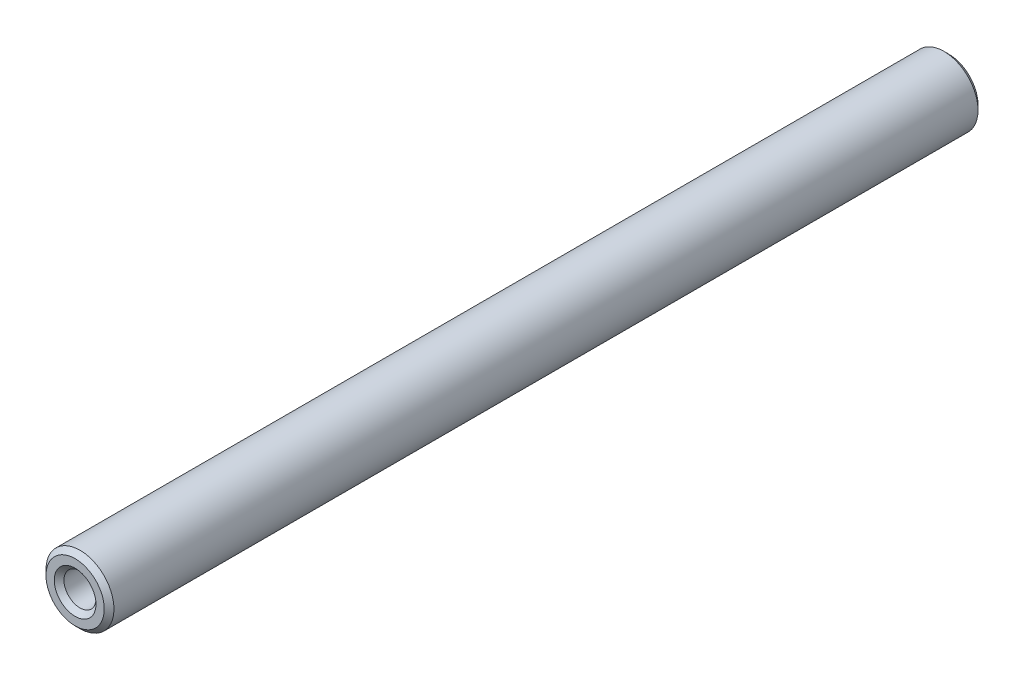
ISO-10303-21;
HEADER;
FILE_DESCRIPTION(('STEP AP214'),'2;1');
FILE_NAME('part.step','',(''),(''),'','','');
FILE_SCHEMA(('AUTOMOTIVE_DESIGN { 1 0 10303 214 1 1 1 1 }'));
ENDSEC;
DATA;
#1=APPLICATION_CONTEXT('core data for automotive mechanical design processes');
#2=APPLICATION_PROTOCOL_DEFINITION('international standard','automotive_design',2000,#1);
#3=PRODUCT_CONTEXT('',#1,'mechanical');
#4=PRODUCT('Part','Part','',(#3));
#5=PRODUCT_RELATED_PRODUCT_CATEGORY('part','',(#4));
#6=PRODUCT_DEFINITION_FORMATION('','',#4);
#7=PRODUCT_DEFINITION_CONTEXT('part definition',#1,'design');
#8=PRODUCT_DEFINITION('design','',#6,#7);
#9=PRODUCT_DEFINITION_SHAPE('','',#8);
#10=(LENGTH_UNIT() NAMED_UNIT(*) SI_UNIT(.MILLI.,.METRE.));
#11=(NAMED_UNIT(*) PLANE_ANGLE_UNIT() SI_UNIT($,.RADIAN.));
#12=(NAMED_UNIT(*) SI_UNIT($,.STERADIAN.) SOLID_ANGLE_UNIT());
#13=UNCERTAINTY_MEASURE_WITH_UNIT(LENGTH_MEASURE(1.E-05),#10,'distance_accuracy_value','');
#14=(GEOMETRIC_REPRESENTATION_CONTEXT(3) GLOBAL_UNCERTAINTY_ASSIGNED_CONTEXT((#13)) GLOBAL_UNIT_ASSIGNED_CONTEXT((#10,
#11,#12)) REPRESENTATION_CONTEXT('',''));
#15=CARTESIAN_POINT('',(0.,0.,0.));
#16=DIRECTION('',(0.,0.,1.));
#17=DIRECTION('',(1.,0.,0.));
#18=AXIS2_PLACEMENT_3D('',#15,#16,#17);
#19=CARTESIAN_POINT('',(0.,0.,45.));
#20=DIRECTION('',(0.,0.,-1.));
#21=DIRECTION('',(-1.,0.,0.));
#22=AXIS2_PLACEMENT_3D('',#19,#20,#21);
#23=CYLINDRICAL_SURFACE('',#22,3.5);
#24=CARTESIAN_POINT('',(0.,0.,-44.4999999999999));
#25=DIRECTION('',(0.,0.,1.));
#26=DIRECTION('',(1.,0.,0.));
#27=AXIS2_PLACEMENT_3D('',#24,#25,#26);
#28=CIRCLE('',#27,3.5);
#29=CARTESIAN_POINT('',(-3.5,0.,-44.5));
#30=VERTEX_POINT('',#29);
#31=EDGE_CURVE('E68',#30,#30,#28,.T.);
#32=CARTESIAN_POINT('',(0.,0.,44.5));
#33=DIRECTION('',(0.,0.,1.));
#34=DIRECTION('',(1.,0.,0.));
#35=AXIS2_PLACEMENT_3D('',#32,#33,#34);
#36=CIRCLE('',#35,3.5);
#37=CARTESIAN_POINT('',(-3.5,0.,44.5));
#38=VERTEX_POINT('',#37);
#39=EDGE_CURVE('E63',#38,#38,#36,.F.);
#40=CARTESIAN_POINT('',(-3.5,0.,-44.5));
#41=CARTESIAN_POINT('',(-3.5,0.,-43.5729166666666));
#42=CARTESIAN_POINT('',(-3.5,0.,-42.6458333333333));
#43=CARTESIAN_POINT('',(-3.5,0.,-40.7916666666666));
#44=CARTESIAN_POINT('',(-3.5,0.,-39.8645833333333));
#45=CARTESIAN_POINT('',(-3.5,0.,-38.0104166666666));
#46=CARTESIAN_POINT('',(-3.5,0.,-37.0833333333333));
#47=CARTESIAN_POINT('',(-3.5,0.,-35.2291666666666));
#48=CARTESIAN_POINT('',(-3.5,0.,-34.3020833333333));
#49=CARTESIAN_POINT('',(-3.5,0.,-32.4479166666666));
#50=CARTESIAN_POINT('',(-3.5,0.,-31.5208333333333));
#51=CARTESIAN_POINT('',(-3.5,0.,-29.6666666666666));
#52=CARTESIAN_POINT('',(-3.5,0.,-28.7395833333333));
#53=CARTESIAN_POINT('',(-3.5,0.,-26.8854166666666));
#54=CARTESIAN_POINT('',(-3.5,0.,-25.9583333333333));
#55=CARTESIAN_POINT('',(-3.5,0.,-24.1041666666666));
#56=CARTESIAN_POINT('',(-3.5,0.,-23.1770833333333));
#57=CARTESIAN_POINT('',(-3.5,0.,-21.3229166666666));
#58=CARTESIAN_POINT('',(-3.5,0.,-20.3958333333333));
#59=CARTESIAN_POINT('',(-3.5,0.,-18.5416666666666));
#60=CARTESIAN_POINT('',(-3.5,0.,-17.6145833333333));
#61=CARTESIAN_POINT('',(-3.5,0.,-15.7604166666666));
#62=CARTESIAN_POINT('',(-3.5,0.,-14.8333333333333));
#63=CARTESIAN_POINT('',(-3.5,0.,-12.9791666666666));
#64=CARTESIAN_POINT('',(-3.5,0.,-12.0520833333333));
#65=CARTESIAN_POINT('',(-3.5,0.,-10.1979166666666));
#66=CARTESIAN_POINT('',(-3.5,0.,-9.2708333333333));
#67=CARTESIAN_POINT('',(-3.5,0.,-7.41666666666663));
#68=CARTESIAN_POINT('',(-3.5,0.,-6.48958333333329));
#69=CARTESIAN_POINT('',(-3.5,0.,-4.63541666666662));
#70=CARTESIAN_POINT('',(-3.5,0.,-3.70833333333329));
#71=CARTESIAN_POINT('',(-3.5,0.,-1.85416666666662));
#72=CARTESIAN_POINT('',(-3.5,0.,-0.927083333333291));
#73=CARTESIAN_POINT('',(-3.5,0.,0.927083333333375));
#74=CARTESIAN_POINT('',(-3.5,0.,1.85416666666671));
#75=CARTESIAN_POINT('',(-3.5,0.,3.70833333333337));
#76=CARTESIAN_POINT('',(-3.5,0.,4.63541666666671));
#77=CARTESIAN_POINT('',(-3.5,0.,6.48958333333337));
#78=CARTESIAN_POINT('',(-3.5,0.,7.41666666666671));
#79=CARTESIAN_POINT('',(-3.5,0.,9.27083333333338));
#80=CARTESIAN_POINT('',(-3.5,0.,10.1979166666667));
#81=CARTESIAN_POINT('',(-3.5,0.,12.0520833333334));
#82=CARTESIAN_POINT('',(-3.5,0.,12.9791666666667));
#83=CARTESIAN_POINT('',(-3.5,0.,14.8333333333334));
#84=CARTESIAN_POINT('',(-3.5,0.,15.7604166666667));
#85=CARTESIAN_POINT('',(-3.5,0.,17.6145833333334));
#86=CARTESIAN_POINT('',(-3.5,0.,18.5416666666667));
#87=CARTESIAN_POINT('',(-3.5,0.,20.3958333333334));
#88=CARTESIAN_POINT('',(-3.5,0.,21.3229166666667));
#89=CARTESIAN_POINT('',(-3.5,0.,23.1770833333334));
#90=CARTESIAN_POINT('',(-3.5,0.,24.1041666666667));
#91=CARTESIAN_POINT('',(-3.5,0.,25.9583333333334));
#92=CARTESIAN_POINT('',(-3.5,0.,26.8854166666667));
#93=CARTESIAN_POINT('',(-3.5,0.,28.7395833333334));
#94=CARTESIAN_POINT('',(-3.5,0.,29.6666666666667));
#95=CARTESIAN_POINT('',(-3.5,0.,31.5208333333334));
#96=CARTESIAN_POINT('',(-3.5,0.,32.4479166666667));
#97=CARTESIAN_POINT('',(-3.5,0.,34.3020833333334));
#98=CARTESIAN_POINT('',(-3.5,0.,35.2291666666667));
#99=CARTESIAN_POINT('',(-3.5,0.,37.0833333333334));
#100=CARTESIAN_POINT('',(-3.5,0.,38.0104166666667));
#101=CARTESIAN_POINT('',(-3.5,0.,39.8645833333334));
#102=CARTESIAN_POINT('',(-3.5,0.,40.7916666666667));
#103=CARTESIAN_POINT('',(-3.5,0.,42.6458333333334));
#104=CARTESIAN_POINT('',(-3.5,0.,43.5729166666667));
#105=CARTESIAN_POINT('',(-3.5,0.,44.5));
#106=B_SPLINE_CURVE_WITH_KNOTS('',3,(#40,#41,#42,#43,#44,#45,#46,#47,#48,#49,#50,#51,#52,#53,
#54,#55,#56,#57,#58,#59,#60,#61,#62,#63,#64,#65,#66,#67,#68,#69,#70,#71,#72,#73,#74,#75,#76,#77,
#78,#79,#80,#81,#82,#83,#84,#85,#86,#87,#88,#89,#90,#91,#92,#93,#94,#95,#96,#97,#98,#99,#100,
#101,#102,#103,#104,#105),.UNSPECIFIED.,.F.,.F.,(4,2,2,2,2,2,2,2,2,2,2,2,2,2,2,2,2,2,2,2,2,2,2,
2,2,2,2,2,2,2,2,2,4),(0.,2.78125,5.5625,8.34375,11.125,13.90625,16.6875,19.46875,22.25,25.03125,
27.8125,30.59375,33.375,36.15625,38.9375,41.71875,44.5,47.28125,50.0625,52.84375,55.625,
58.40625,61.1875,63.96875,66.75,69.53125,72.3125,75.09375,77.875,80.65625,83.4375,86.21875,89.),.UNSPECIFIED.);
#107=EDGE_CURVE('BSEAM36',#30,#38,#106,.T.);
#108=ORIENTED_EDGE('',*,*,#31,.T.);
#109=ORIENTED_EDGE('',*,*,#39,.T.);
#110=ORIENTED_EDGE('',*,*,#107,.T.);
#111=ORIENTED_EDGE('',*,*,#107,.F.);
#112=EDGE_LOOP('',(#108,#110,#109,#111));
#113=FACE_BOUND('',#112,.T.);
#114=ADVANCED_FACE('F36',(#113),#23,.T.);
#115=CARTESIAN_POINT('',(0.,0.,45.));
#116=DIRECTION('',(0.,0.,1.));
#117=DIRECTION('',(1.,0.,0.));
#118=AXIS2_PLACEMENT_3D('',#115,#116,#117);
#119=PLANE('',#118);
#120=CARTESIAN_POINT('',(0.,0.,45.));
#121=DIRECTION('',(0.,0.,1.));
#122=DIRECTION('',(1.,0.,0.));
#123=AXIS2_PLACEMENT_3D('',#120,#121,#122);
#124=CIRCLE('',#123,3.00000000000004);
#125=CARTESIAN_POINT('',(3.00000000000004,0.,45.));
#126=VERTEX_POINT('',#125);
#127=EDGE_CURVE('E44',#126,#126,#124,.T.);
#128=ORIENTED_EDGE('',*,*,#127,.T.);
#129=EDGE_LOOP('',(#128));
#130=FACE_BOUND('',#129,.T.);
#131=CARTESIAN_POINT('',(0.,0.,45.));
#132=DIRECTION('',(0.,0.,1.));
#133=DIRECTION('',(1.,0.,0.));
#134=AXIS2_PLACEMENT_3D('',#131,#132,#133);
#135=CIRCLE('',#134,2.14999999999999);
#136=CARTESIAN_POINT('',(2.14999999999999,0.,45.));
#137=VERTEX_POINT('',#136);
#138=EDGE_CURVE('E80',#137,#137,#135,.F.);
#139=ORIENTED_EDGE('',*,*,#138,.T.);
#140=EDGE_LOOP('',(#139));
#141=FACE_BOUND('',#140,.T.);
#142=ADVANCED_FACE('F85',(#130,#141),#119,.T.);
#143=CARTESIAN_POINT('',(0.,0.,-45.));
#144=DIRECTION('',(0.,0.,1.));
#145=DIRECTION('',(1.,0.,0.));
#146=AXIS2_PLACEMENT_3D('',#143,#144,#145);
#147=PLANE('',#146);
#148=CARTESIAN_POINT('',(0.,0.,-45.));
#149=DIRECTION('',(0.,0.,1.));
#150=DIRECTION('',(1.,0.,0.));
#151=AXIS2_PLACEMENT_3D('',#148,#149,#150);
#152=CIRCLE('',#151,2.99999999999995);
#153=CARTESIAN_POINT('',(2.99999999999995,0.,-45.));
#154=VERTEX_POINT('',#153);
#155=EDGE_CURVE('E74',#154,#154,#152,.F.);
#156=ORIENTED_EDGE('',*,*,#155,.T.);
#157=EDGE_LOOP('',(#156));
#158=FACE_BOUND('',#157,.T.);
#159=CARTESIAN_POINT('',(0.,0.,-45.));
#160=DIRECTION('',(0.,0.,1.));
#161=DIRECTION('',(1.,0.,0.));
#162=AXIS2_PLACEMENT_3D('',#159,#160,#161);
#163=CIRCLE('',#162,2.14999999999999);
#164=CARTESIAN_POINT('',(2.14999999999999,0.,-45.));
#165=VERTEX_POINT('',#164);
#166=EDGE_CURVE('E71',#165,#165,#163,.T.);
#167=ORIENTED_EDGE('',*,*,#166,.T.);
#168=EDGE_LOOP('',(#167));
#169=FACE_BOUND('',#168,.T.);
#170=ADVANCED_FACE('F107',(#158,#169),#147,.F.);
#171=CARTESIAN_POINT('',(0.,0.,-32.9));
#172=DIRECTION('',(0.,0.,-1.));
#173=DIRECTION('',(-1.,0.,0.));
#174=AXIS2_PLACEMENT_3D('',#171,#172,#173);
#175=CONICAL_SURFACE('',#174,1.65,1.02974425867665);
#176=CARTESIAN_POINT('',(0.,0.,-31.9085799786045));
#177=VERTEX_POINT('',#176);
#178=VERTEX_LOOP('',#177);
#179=FACE_BOUND('',#178,.T.);
#180=CARTESIAN_POINT('',(0.,0.,-32.9));
#181=DIRECTION('',(0.,0.,-1.));
#182=DIRECTION('',(-1.,0.,0.));
#183=AXIS2_PLACEMENT_3D('',#180,#181,#182);
#184=CIRCLE('',#183,1.65);
#185=CARTESIAN_POINT('',(-1.65,0.,-32.9));
#186=VERTEX_POINT('',#185);
#187=EDGE_CURVE('E60',#186,#186,#184,.T.);
#188=ORIENTED_EDGE('',*,*,#187,.T.);
#189=EDGE_LOOP('',(#188));
#190=FACE_BOUND('',#189,.T.);
#191=ADVANCED_FACE('F125',(#179,#190),#175,.F.);
#192=CARTESIAN_POINT('',(0.,0.,-45.));
#193=DIRECTION('',(0.,0.,-1.));
#194=DIRECTION('',(-1.,0.,0.));
#195=AXIS2_PLACEMENT_3D('',#192,#193,#194);
#196=CYLINDRICAL_SURFACE('',#195,1.65);
#197=CARTESIAN_POINT('',(0.,0.,-44.5));
#198=DIRECTION('',(0.,0.,1.));
#199=DIRECTION('',(1.,0.,0.));
#200=AXIS2_PLACEMENT_3D('',#197,#198,#199);
#201=CIRCLE('',#200,1.65);
#202=CARTESIAN_POINT('',(1.65,0.,-44.5));
#203=VERTEX_POINT('',#202);
#204=EDGE_CURVE('E77',#203,#203,#201,.F.);
#205=ORIENTED_EDGE('',*,*,#204,.T.);
#206=EDGE_LOOP('',(#205));
#207=FACE_BOUND('',#206,.T.);
#208=ORIENTED_EDGE('',*,*,#187,.F.);
#209=EDGE_LOOP('',(#208));
#210=FACE_BOUND('',#209,.T.);
#211=ADVANCED_FACE('F54',(#207,#210),#196,.F.);
#212=CARTESIAN_POINT('',(0.,0.,32.9));
#213=DIRECTION('',(0.,0.,1.));
#214=DIRECTION('',(1.,0.,0.));
#215=AXIS2_PLACEMENT_3D('',#212,#213,#214);
#216=CONICAL_SURFACE('',#215,1.65,1.02974425867665);
#217=CARTESIAN_POINT('',(0.,0.,31.9085799786045));
#218=VERTEX_POINT('',#217);
#219=VERTEX_LOOP('',#218);
#220=FACE_BOUND('',#219,.T.);
#221=CARTESIAN_POINT('',(0.,0.,32.9));
#222=DIRECTION('',(0.,0.,1.));
#223=DIRECTION('',(1.,0.,0.));
#224=AXIS2_PLACEMENT_3D('',#221,#222,#223);
#225=CIRCLE('',#224,1.65);
#226=CARTESIAN_POINT('',(1.65,0.,32.9));
#227=VERTEX_POINT('',#226);
#228=EDGE_CURVE('E58',#227,#227,#225,.T.);
#229=ORIENTED_EDGE('',*,*,#228,.T.);
#230=EDGE_LOOP('',(#229));
#231=FACE_BOUND('',#230,.T.);
#232=ADVANCED_FACE('F50',(#220,#231),#216,.F.);
#233=CARTESIAN_POINT('',(0.,0.,45.));
#234=DIRECTION('',(0.,0.,1.));
#235=DIRECTION('',(1.,0.,0.));
#236=AXIS2_PLACEMENT_3D('',#233,#234,#235);
#237=CYLINDRICAL_SURFACE('',#236,1.65);
#238=CARTESIAN_POINT('',(0.,0.,44.5));
#239=DIRECTION('',(0.,0.,1.));
#240=DIRECTION('',(1.,0.,0.));
#241=AXIS2_PLACEMENT_3D('',#238,#239,#240);
#242=CIRCLE('',#241,1.65);
#243=CARTESIAN_POINT('',(1.65,0.,44.5));
#244=VERTEX_POINT('',#243);
#245=EDGE_CURVE('E11',#244,#244,#242,.T.);
#246=ORIENTED_EDGE('',*,*,#245,.T.);
#247=EDGE_LOOP('',(#246));
#248=FACE_BOUND('',#247,.T.);
#249=ORIENTED_EDGE('',*,*,#228,.F.);
#250=EDGE_LOOP('',(#249));
#251=FACE_BOUND('',#250,.T.);
#252=ADVANCED_FACE('F53',(#248,#251),#237,.F.);
#253=CARTESIAN_POINT('',(0.,0.,-44.4999999999999));
#254=DIRECTION('',(0.,0.,1.));
#255=DIRECTION('',(1.,0.,0.));
#256=AXIS2_PLACEMENT_3D('',#253,#254,#255);
#257=CONICAL_SURFACE('',#256,3.5,0.785398163397449);
#258=ORIENTED_EDGE('',*,*,#155,.F.);
#259=EDGE_LOOP('',(#258));
#260=FACE_BOUND('',#259,.T.);
#261=ORIENTED_EDGE('',*,*,#31,.F.);
#262=EDGE_LOOP('',(#261));
#263=FACE_BOUND('',#262,.T.);
#264=ADVANCED_FACE('F97',(#260,#263),#257,.T.);
#265=CARTESIAN_POINT('',(0.,0.,-44.5));
#266=DIRECTION('',(0.,0.,-1.));
#267=DIRECTION('',(-1.,0.,0.));
#268=AXIS2_PLACEMENT_3D('',#265,#266,#267);
#269=CONICAL_SURFACE('',#268,1.65,0.785398163397456);
#270=ORIENTED_EDGE('',*,*,#166,.F.);
#271=EDGE_LOOP('',(#270));
#272=FACE_BOUND('',#271,.T.);
#273=ORIENTED_EDGE('',*,*,#204,.F.);
#274=EDGE_LOOP('',(#273));
#275=FACE_BOUND('',#274,.T.);
#276=ADVANCED_FACE('F90',(#272,#275),#269,.F.);
#277=CARTESIAN_POINT('',(0.,0.,45.));
#278=DIRECTION('',(0.,0.,-1.));
#279=DIRECTION('',(-1.,0.,0.));
#280=AXIS2_PLACEMENT_3D('',#277,#278,#279);
#281=CONICAL_SURFACE('',#280,3.00000000000004,0.785398163397449);
#282=ORIENTED_EDGE('',*,*,#39,.F.);
#283=EDGE_LOOP('',(#282));
#284=FACE_BOUND('',#283,.T.);
#285=ORIENTED_EDGE('',*,*,#127,.F.);
#286=EDGE_LOOP('',(#285));
#287=FACE_BOUND('',#286,.T.);
#288=ADVANCED_FACE('F88',(#284,#287),#281,.T.);
#289=CARTESIAN_POINT('',(0.,0.,44.5));
#290=DIRECTION('',(0.,0.,1.));
#291=DIRECTION('',(1.,0.,0.));
#292=AXIS2_PLACEMENT_3D('',#289,#290,#291);
#293=CONICAL_SURFACE('',#292,1.65,0.785398163397456);
#294=ORIENTED_EDGE('',*,*,#138,.F.);
#295=EDGE_LOOP('',(#294));
#296=FACE_BOUND('',#295,.T.);
#297=ORIENTED_EDGE('',*,*,#245,.F.);
#298=EDGE_LOOP('',(#297));
#299=FACE_BOUND('',#298,.T.);
#300=ADVANCED_FACE('F38',(#296,#299),#293,.F.);
#301=CLOSED_SHELL('',(#114,#142,#170,#191,#211,#232,#252,#264,#276,#288,#300));
#302=MANIFOLD_SOLID_BREP('B2',#301);
#303=ADVANCED_BREP_SHAPE_REPRESENTATION('',(#18,#302),#14);
#304=SHAPE_DEFINITION_REPRESENTATION(#9,#303);
ENDSEC;
END-ISO-10303-21;
